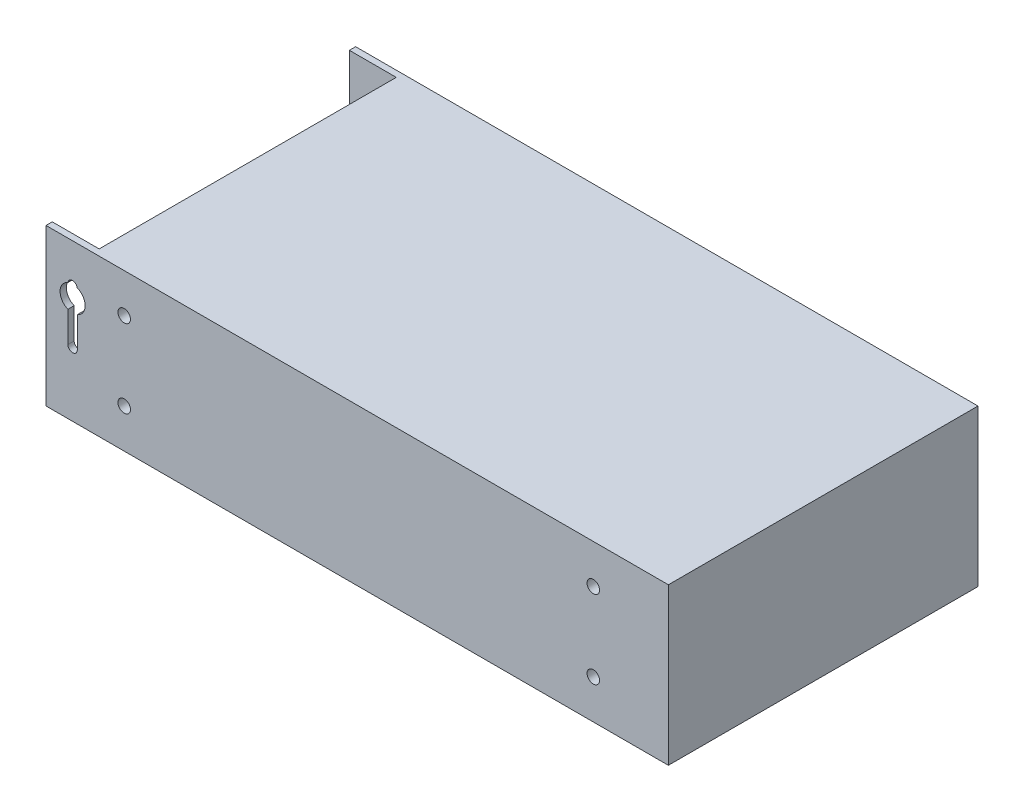
ISO-10303-21;
HEADER;
FILE_DESCRIPTION(('STEP AP214'),'2;1');
FILE_NAME('part.step','',(''),(''),'','','');
FILE_SCHEMA(('AUTOMOTIVE_DESIGN { 1 0 10303 214 1 1 1 1 }'));
ENDSEC;
DATA;
#1=APPLICATION_CONTEXT('core data for automotive mechanical design processes');
#2=APPLICATION_PROTOCOL_DEFINITION('international standard','automotive_design',2000,#1);
#3=PRODUCT_CONTEXT('',#1,'mechanical');
#4=PRODUCT('Part','Part','',(#3));
#5=PRODUCT_RELATED_PRODUCT_CATEGORY('part','',(#4));
#6=PRODUCT_DEFINITION_FORMATION('','',#4);
#7=PRODUCT_DEFINITION_CONTEXT('part definition',#1,'design');
#8=PRODUCT_DEFINITION('design','',#6,#7);
#9=PRODUCT_DEFINITION_SHAPE('','',#8);
#10=(LENGTH_UNIT() NAMED_UNIT(*) SI_UNIT(.MILLI.,.METRE.));
#11=(NAMED_UNIT(*) PLANE_ANGLE_UNIT() SI_UNIT($,.RADIAN.));
#12=(NAMED_UNIT(*) SI_UNIT($,.STERADIAN.) SOLID_ANGLE_UNIT());
#13=UNCERTAINTY_MEASURE_WITH_UNIT(LENGTH_MEASURE(1.E-05),#10,'distance_accuracy_value','');
#14=(GEOMETRIC_REPRESENTATION_CONTEXT(3) GLOBAL_UNCERTAINTY_ASSIGNED_CONTEXT((#13)) GLOBAL_UNIT_ASSIGNED_CONTEXT((#10,
#11,#12)) REPRESENTATION_CONTEXT('',''));
#15=CARTESIAN_POINT('',(0.,0.,0.));
#16=DIRECTION('',(0.,0.,1.));
#17=DIRECTION('',(1.,0.,0.));
#18=AXIS2_PLACEMENT_3D('',#15,#16,#17);
#19=CARTESIAN_POINT('',(0.,9.,0.));
#20=DIRECTION('',(0.,-1.,0.));
#21=DIRECTION('',(0.,0.,-1.));
#22=AXIS2_PLACEMENT_3D('',#19,#20,#21);
#23=PLANE('',#22);
#24=DIRECTION('',(0.,0.,1.));
#25=VECTOR('',#24,1.);
#26=CARTESIAN_POINT('',(-72.7493541907483,9.,-45.9880603807705));
#27=LINE('',#26,#25);
#28=CARTESIAN_POINT('',(-72.7493541907483,9.,-45.9880603807705));
#29=VERTEX_POINT('',#28);
#30=CARTESIAN_POINT('',(-72.7493541907483,9.,49.0119396192294));
#31=VERTEX_POINT('',#30);
#32=EDGE_CURVE('E207',#29,#31,#27,.T.);
#33=ORIENTED_EDGE('',*,*,#32,.F.);
#34=DIRECTION('',(1.,0.,0.));
#35=VECTOR('',#34,1.);
#36=CARTESIAN_POINT('',(-87.7493541907484,9.,-45.9880603807705));
#37=LINE('',#36,#35);
#38=CARTESIAN_POINT('',(-87.7493541907484,9.,-45.9880603807705));
#39=VERTEX_POINT('',#38);
#40=EDGE_CURVE('E218',#39,#29,#37,.T.);
#41=ORIENTED_EDGE('',*,*,#40,.F.);
#42=DIRECTION('',(0.,0.,1.));
#43=VECTOR('',#42,1.);
#44=CARTESIAN_POINT('',(-87.7493541907484,9.,-47.9880603807706));
#45=LINE('',#44,#43);
#46=CARTESIAN_POINT('',(-87.7493541907484,9.,49.0119396192295));
#47=VERTEX_POINT('',#46);
#48=EDGE_CURVE('E249',#39,#47,#45,.T.);
#49=ORIENTED_EDGE('',*,*,#48,.T.);
#50=DIRECTION('',(-1.,0.,0.));
#51=VECTOR('',#50,1.);
#52=CARTESIAN_POINT('',(111.250645809264,9.,49.0119396192294));
#53=LINE('',#52,#51);
#54=EDGE_CURVE('E38',#31,#47,#53,.T.);
#55=ORIENTED_EDGE('',*,*,#54,.F.);
#56=EDGE_LOOP('',(#33,#41,#49,#55));
#57=FACE_BOUND('',#56,.T.);
#58=ADVANCED_FACE('F34',(#57),#23,.F.);
#59=CARTESIAN_POINT('',(111.250645809264,50.,49.0119396192294));
#60=DIRECTION('',(0.,0.,1.));
#61=DIRECTION('',(1.,0.,0.));
#62=AXIS2_PLACEMENT_3D('',#59,#60,#61);
#63=PLANE('',#62);
#64=DIRECTION('',(0.,1.,0.));
#65=VECTOR('',#64,1.);
#66=CARTESIAN_POINT('',(-77.7493541907484,50.,49.0119396192295));
#67=LINE('',#66,#65);
#68=CARTESIAN_POINT('',(-77.7493541907484,20.5,49.0119396192295));
#69=VERTEX_POINT('',#68);
#70=CARTESIAN_POINT('',(-77.7493541907484,30.2919007564522,49.0119396192295));
#71=VERTEX_POINT('',#70);
#72=EDGE_CURVE('E185',#69,#71,#67,.T.);
#73=ORIENTED_EDGE('',*,*,#72,.T.);
#74=CARTESIAN_POINT('',(-79.2493541907484,34.,49.0119396192295));
#75=DIRECTION('',(0.,0.,1.));
#76=DIRECTION('',(1.,0.,0.));
#77=AXIS2_PLACEMENT_3D('',#74,#75,#76);
#78=CIRCLE('',#77,4.00000000000001);
#79=CARTESIAN_POINT('',(-77.7647392128322,37.7142857142857,49.0119396192295));
#80=VERTEX_POINT('',#79);
#81=EDGE_CURVE('E188',#71,#80,#78,.T.);
#82=ORIENTED_EDGE('',*,*,#81,.T.);
#83=CARTESIAN_POINT('',(-79.2493541907484,37.5,49.0119396192295));
#84=DIRECTION('',(0.,0.,1.));
#85=DIRECTION('',(1.,0.,0.));
#86=AXIS2_PLACEMENT_3D('',#83,#84,#85);
#87=CIRCLE('',#86,1.5);
#88=CARTESIAN_POINT('',(-80.7339691686645,37.7142857142857,49.0119396192295));
#89=VERTEX_POINT('',#88);
#90=EDGE_CURVE('E171',#80,#89,#87,.T.);
#91=ORIENTED_EDGE('',*,*,#90,.T.);
#92=CARTESIAN_POINT('',(-79.2493541907484,34.,49.0119396192295));
#93=DIRECTION('',(0.,0.,1.));
#94=DIRECTION('',(1.,0.,0.));
#95=AXIS2_PLACEMENT_3D('',#92,#93,#94);
#96=CIRCLE('',#95,4.00000000000001);
#97=CARTESIAN_POINT('',(-80.7493541907484,30.2919007564522,49.0119396192295));
#98=VERTEX_POINT('',#97);
#99=EDGE_CURVE('E144',#89,#98,#96,.T.);
#100=ORIENTED_EDGE('',*,*,#99,.T.);
#101=DIRECTION('',(0.,1.,0.));
#102=VECTOR('',#101,1.);
#103=CARTESIAN_POINT('',(-80.7493541907484,50.,49.0119396192295));
#104=LINE('',#103,#102);
#105=CARTESIAN_POINT('',(-80.7493541907484,20.5,49.0119396192295));
#106=VERTEX_POINT('',#105);
#107=EDGE_CURVE('E180',#106,#98,#104,.T.);
#108=ORIENTED_EDGE('',*,*,#107,.F.);
#109=CARTESIAN_POINT('',(-79.2493541907484,20.5,49.0119396192295));
#110=DIRECTION('',(0.,0.,1.));
#111=DIRECTION('',(1.,0.,0.));
#112=AXIS2_PLACEMENT_3D('',#109,#110,#111);
#113=CIRCLE('',#112,1.5);
#114=EDGE_CURVE('E182',#106,#69,#113,.T.);
#115=ORIENTED_EDGE('',*,*,#114,.T.);
#116=EDGE_LOOP('',(#73,#82,#91,#100,#108,#115));
#117=FACE_BOUND('',#116,.T.);
#118=DIRECTION('',(0.,-1.,0.));
#119=VECTOR('',#118,1.);
#120=CARTESIAN_POINT('',(-72.7493541907483,50.,49.0119396192294));
#121=LINE('',#120,#119);
#122=CARTESIAN_POINT('',(-72.7493541907483,50.,49.0119396192294));
#123=VERTEX_POINT('',#122);
#124=EDGE_CURVE('E212',#123,#31,#121,.T.);
#125=ORIENTED_EDGE('',*,*,#124,.T.);
#126=ORIENTED_EDGE('',*,*,#54,.T.);
#127=DIRECTION('',(0.,-1.,0.));
#128=VECTOR('',#127,1.);
#129=CARTESIAN_POINT('',(-87.7493541907484,50.,49.0119396192295));
#130=LINE('',#129,#128);
#131=CARTESIAN_POINT('',(-87.7493541907484,50.,49.0119396192295));
#132=VERTEX_POINT('',#131);
#133=EDGE_CURVE('E242',#132,#47,#130,.T.);
#134=ORIENTED_EDGE('',*,*,#133,.F.);
#135=DIRECTION('',(-1.,0.,0.));
#136=VECTOR('',#135,1.);
#137=CARTESIAN_POINT('',(111.250645809264,50.,49.0119396192294));
#138=LINE('',#137,#136);
#139=EDGE_CURVE('E235',#123,#132,#138,.T.);
#140=ORIENTED_EDGE('',*,*,#139,.F.);
#141=EDGE_LOOP('',(#125,#126,#134,#140));
#142=FACE_BOUND('',#141,.T.);
#143=ADVANCED_FACE('F298',(#117,#142),#63,.F.);
#144=CARTESIAN_POINT('',(-87.7493541907484,50.,-45.9880603807705));
#145=DIRECTION('',(0.,0.,-1.));
#146=DIRECTION('',(-1.,0.,0.));
#147=AXIS2_PLACEMENT_3D('',#144,#145,#146);
#148=PLANE('',#147);
#149=DIRECTION('',(0.,-1.,0.));
#150=VECTOR('',#149,1.);
#151=CARTESIAN_POINT('',(-72.7493541907483,50.,-45.9880603807705));
#152=LINE('',#151,#150);
#153=CARTESIAN_POINT('',(-72.7493541907483,50.,-45.9880603807705));
#154=VERTEX_POINT('',#153);
#155=EDGE_CURVE('E216',#154,#29,#152,.T.);
#156=ORIENTED_EDGE('',*,*,#155,.F.);
#157=DIRECTION('',(1.,0.,0.));
#158=VECTOR('',#157,1.);
#159=CARTESIAN_POINT('',(-87.7493541907484,50.,-45.9880603807705));
#160=LINE('',#159,#158);
#161=CARTESIAN_POINT('',(-87.7493541907484,50.,-45.9880603807705));
#162=VERTEX_POINT('',#161);
#163=EDGE_CURVE('E222',#162,#154,#160,.T.);
#164=ORIENTED_EDGE('',*,*,#163,.F.);
#165=DIRECTION('',(0.,-1.,0.));
#166=VECTOR('',#165,1.);
#167=CARTESIAN_POINT('',(-87.7493541907484,50.,-45.9880603807705));
#168=LINE('',#167,#166);
#169=EDGE_CURVE('E228',#162,#39,#168,.T.);
#170=ORIENTED_EDGE('',*,*,#169,.T.);
#171=ORIENTED_EDGE('',*,*,#40,.T.);
#172=EDGE_LOOP('',(#156,#164,#170,#171));
#173=FACE_BOUND('',#172,.T.);
#174=ADVANCED_FACE('F289',(#173),#148,.F.);
#175=CARTESIAN_POINT('',(111.250645809264,9.,-47.9880603807706));
#176=DIRECTION('',(-1.,0.,0.));
#177=DIRECTION('',(0.,0.,1.));
#178=AXIS2_PLACEMENT_3D('',#175,#176,#177);
#179=PLANE('',#178);
#180=DIRECTION('',(0.,0.,-1.));
#181=VECTOR('',#180,1.);
#182=CARTESIAN_POINT('',(111.250645809264,0.,-47.9880603807706));
#183=LINE('',#182,#181);
#184=CARTESIAN_POINT('',(111.250645809264,0.,51.0119396192294));
#185=VERTEX_POINT('',#184);
#186=CARTESIAN_POINT('',(111.250645809264,0.,-47.9880603807706));
#187=VERTEX_POINT('',#186);
#188=EDGE_CURVE('E247',#185,#187,#183,.T.);
#189=ORIENTED_EDGE('',*,*,#188,.T.);
#190=DIRECTION('',(0.,-1.,0.));
#191=VECTOR('',#190,1.);
#192=CARTESIAN_POINT('',(111.250645809264,9.,-47.9880603807706));
#193=LINE('',#192,#191);
#194=CARTESIAN_POINT('',(111.250645809264,50.,-47.9880603807706));
#195=VERTEX_POINT('',#194);
#196=EDGE_CURVE('E11',#195,#187,#193,.T.);
#197=ORIENTED_EDGE('',*,*,#196,.F.);
#198=DIRECTION('',(0.,0.,-1.));
#199=VECTOR('',#198,1.);
#200=CARTESIAN_POINT('',(111.250645809264,50.,51.0119396192294));
#201=LINE('',#200,#199);
#202=CARTESIAN_POINT('',(111.250645809264,50.,51.0119396192294));
#203=VERTEX_POINT('',#202);
#204=EDGE_CURVE('E233',#203,#195,#201,.T.);
#205=ORIENTED_EDGE('',*,*,#204,.F.);
#206=DIRECTION('',(0.,-1.,0.));
#207=VECTOR('',#206,1.);
#208=CARTESIAN_POINT('',(111.250645809264,9.,51.0119396192294));
#209=LINE('',#208,#207);
#210=EDGE_CURVE('E252',#203,#185,#209,.T.);
#211=ORIENTED_EDGE('',*,*,#210,.T.);
#212=EDGE_LOOP('',(#189,#197,#205,#211));
#213=FACE_BOUND('',#212,.T.);
#214=ADVANCED_FACE('F36',(#213),#179,.F.);
#215=CARTESIAN_POINT('',(111.250645809264,9.,-47.9880603807706));
#216=DIRECTION('',(0.,0.,1.));
#217=DIRECTION('',(1.,0.,0.));
#218=AXIS2_PLACEMENT_3D('',#215,#216,#217);
#219=PLANE('',#218);
#220=CARTESIAN_POINT('',(-62.7493541907484,12.5,-47.9880603807706));
#221=DIRECTION('',(0.,0.,-1.));
#222=DIRECTION('',(-1.,0.,0.));
#223=AXIS2_PLACEMENT_3D('',#220,#221,#222);
#224=CIRCLE('',#223,2.);
#225=CARTESIAN_POINT('',(-64.7493541907484,12.5,-47.9880603807706));
#226=VERTEX_POINT('',#225);
#227=EDGE_CURVE('E428',#226,#226,#224,.T.);
#228=ORIENTED_EDGE('',*,*,#227,.F.);
#229=EDGE_LOOP('',(#228));
#230=FACE_BOUND('',#229,.T.);
#231=CARTESIAN_POINT('',(87.2506458092516,12.5,-47.9880603807706));
#232=DIRECTION('',(0.,0.,-1.));
#233=DIRECTION('',(-1.,0.,0.));
#234=AXIS2_PLACEMENT_3D('',#231,#232,#233);
#235=CIRCLE('',#234,2.);
#236=CARTESIAN_POINT('',(85.2506458092516,12.5,-47.9880603807706));
#237=VERTEX_POINT('',#236);
#238=EDGE_CURVE('E433',#237,#237,#235,.T.);
#239=ORIENTED_EDGE('',*,*,#238,.F.);
#240=EDGE_LOOP('',(#239));
#241=FACE_BOUND('',#240,.T.);
#242=DIRECTION('',(-1.,0.,0.));
#243=VECTOR('',#242,1.);
#244=CARTESIAN_POINT('',(111.250645809264,0.,-47.9880603807706));
#245=LINE('',#244,#243);
#246=CARTESIAN_POINT('',(-87.7493541907484,0.,-47.9880603807706));
#247=VERTEX_POINT('',#246);
#248=EDGE_CURVE('E267',#187,#247,#245,.T.);
#249=ORIENTED_EDGE('',*,*,#248,.T.);
#250=DIRECTION('',(0.,-1.,0.));
#251=VECTOR('',#250,1.);
#252=CARTESIAN_POINT('',(-87.7493541907484,9.,-47.9880603807706));
#253=LINE('',#252,#251);
#254=CARTESIAN_POINT('',(-87.7493541907484,50.,-47.9880603807706));
#255=VERTEX_POINT('',#254);
#256=EDGE_CURVE('E44',#255,#247,#253,.T.);
#257=ORIENTED_EDGE('',*,*,#256,.F.);
#258=DIRECTION('',(-1.,0.,0.));
#259=VECTOR('',#258,1.);
#260=CARTESIAN_POINT('',(-87.7493541907484,50.,-47.9880603807706));
#261=LINE('',#260,#259);
#262=EDGE_CURVE('E225',#195,#255,#261,.T.);
#263=ORIENTED_EDGE('',*,*,#262,.F.);
#264=ORIENTED_EDGE('',*,*,#196,.T.);
#265=EDGE_LOOP('',(#249,#257,#263,#264));
#266=FACE_BOUND('',#265,.T.);
#267=ADVANCED_FACE('F279',(#230,#241,#266),#219,.F.);
#268=CARTESIAN_POINT('',(-87.7493541907484,9.,-47.9880603807706));
#269=DIRECTION('',(1.,0.,0.));
#270=DIRECTION('',(0.,0.,-1.));
#271=AXIS2_PLACEMENT_3D('',#268,#269,#270);
#272=PLANE('',#271);
#273=DIRECTION('',(0.,0.,1.));
#274=VECTOR('',#273,1.);
#275=CARTESIAN_POINT('',(-87.7493541907484,0.,-47.9880603807706));
#276=LINE('',#275,#274);
#277=CARTESIAN_POINT('',(-87.7493541907484,0.,51.0119396192295));
#278=VERTEX_POINT('',#277);
#279=EDGE_CURVE('E266',#247,#278,#276,.T.);
#280=ORIENTED_EDGE('',*,*,#279,.T.);
#281=DIRECTION('',(0.,-1.,0.));
#282=VECTOR('',#281,1.);
#283=CARTESIAN_POINT('',(-87.7493541907484,9.,51.0119396192295));
#284=LINE('',#283,#282);
#285=CARTESIAN_POINT('',(-87.7493541907484,50.,51.0119396192294));
#286=VERTEX_POINT('',#285);
#287=EDGE_CURVE('E260',#286,#278,#284,.T.);
#288=ORIENTED_EDGE('',*,*,#287,.F.);
#289=DIRECTION('',(0.,0.,1.));
#290=VECTOR('',#289,1.);
#291=CARTESIAN_POINT('',(-87.7493541907484,50.,51.0119396192294));
#292=LINE('',#291,#290);
#293=EDGE_CURVE('E237',#132,#286,#292,.T.);
#294=ORIENTED_EDGE('',*,*,#293,.F.);
#295=ORIENTED_EDGE('',*,*,#133,.T.);
#296=ORIENTED_EDGE('',*,*,#48,.F.);
#297=ORIENTED_EDGE('',*,*,#169,.F.);
#298=DIRECTION('',(0.,0.,1.));
#299=VECTOR('',#298,1.);
#300=CARTESIAN_POINT('',(-87.7493541907484,50.,-47.9880603807706));
#301=LINE('',#300,#299);
#302=EDGE_CURVE('E219',#255,#162,#301,.T.);
#303=ORIENTED_EDGE('',*,*,#302,.F.);
#304=ORIENTED_EDGE('',*,*,#256,.T.);
#305=EDGE_LOOP('',(#280,#288,#294,#295,#296,#297,#303,#304));
#306=FACE_BOUND('',#305,.T.);
#307=ADVANCED_FACE('F285',(#306),#272,.F.);
#308=CARTESIAN_POINT('',(111.250645809264,9.,51.0119396192294));
#309=DIRECTION('',(0.,0.,-1.));
#310=DIRECTION('',(-1.,0.,0.));
#311=AXIS2_PLACEMENT_3D('',#308,#309,#310);
#312=PLANE('',#311);
#313=CARTESIAN_POINT('',(-79.2493541907484,37.5,51.0119396192294));
#314=DIRECTION('',(0.,0.,1.));
#315=DIRECTION('',(1.,0.,0.));
#316=AXIS2_PLACEMENT_3D('',#313,#314,#315);
#317=CIRCLE('',#316,1.5);
#318=CARTESIAN_POINT('',(-77.7647392128322,37.7142857142857,51.0119396192295));
#319=VERTEX_POINT('',#318);
#320=CARTESIAN_POINT('',(-80.7339691686645,37.7142857142857,51.0119396192294));
#321=VERTEX_POINT('',#320);
#322=EDGE_CURVE('E150',#319,#321,#317,.T.);
#323=ORIENTED_EDGE('',*,*,#322,.F.);
#324=CARTESIAN_POINT('',(-79.2493541907484,34.,51.0119396192294));
#325=DIRECTION('',(0.,0.,1.));
#326=DIRECTION('',(1.,0.,0.));
#327=AXIS2_PLACEMENT_3D('',#324,#325,#326);
#328=CIRCLE('',#327,4.00000000000001);
#329=CARTESIAN_POINT('',(-77.7493541907484,30.2919007564522,51.0119396192294));
#330=VERTEX_POINT('',#329);
#331=EDGE_CURVE('E60',#330,#319,#328,.T.);
#332=ORIENTED_EDGE('',*,*,#331,.F.);
#333=DIRECTION('',(0.,1.,0.));
#334=VECTOR('',#333,1.);
#335=CARTESIAN_POINT('',(-77.7493541907484,0.,51.0119396192294));
#336=LINE('',#335,#334);
#337=CARTESIAN_POINT('',(-77.7493541907484,20.5,51.0119396192294));
#338=VERTEX_POINT('',#337);
#339=EDGE_CURVE('E166',#338,#330,#336,.T.);
#340=ORIENTED_EDGE('',*,*,#339,.F.);
#341=CARTESIAN_POINT('',(-79.2493541907484,20.5,51.0119396192294));
#342=DIRECTION('',(0.,0.,1.));
#343=DIRECTION('',(1.,0.,0.));
#344=AXIS2_PLACEMENT_3D('',#341,#342,#343);
#345=CIRCLE('',#344,1.5);
#346=CARTESIAN_POINT('',(-80.7493541907484,20.5,51.0119396192294));
#347=VERTEX_POINT('',#346);
#348=EDGE_CURVE('E160',#347,#338,#345,.T.);
#349=ORIENTED_EDGE('',*,*,#348,.F.);
#350=DIRECTION('',(0.,1.,0.));
#351=VECTOR('',#350,1.);
#352=CARTESIAN_POINT('',(-80.7493541907484,0.,51.0119396192294));
#353=LINE('',#352,#351);
#354=CARTESIAN_POINT('',(-80.7493541907484,30.2919007564522,51.0119396192294));
#355=VERTEX_POINT('',#354);
#356=EDGE_CURVE('E158',#347,#355,#353,.T.);
#357=ORIENTED_EDGE('',*,*,#356,.T.);
#358=CARTESIAN_POINT('',(-79.2493541907484,34.,51.0119396192294));
#359=DIRECTION('',(0.,0.,1.));
#360=DIRECTION('',(1.,0.,0.));
#361=AXIS2_PLACEMENT_3D('',#358,#359,#360);
#362=CIRCLE('',#361,4.00000000000001);
#363=EDGE_CURVE('E141',#321,#355,#362,.T.);
#364=ORIENTED_EDGE('',*,*,#363,.F.);
#365=EDGE_LOOP('',(#323,#332,#340,#349,#357,#364));
#366=FACE_BOUND('',#365,.T.);
#367=CARTESIAN_POINT('',(87.2506458092417,12.4999999999993,51.0119396192294));
#368=DIRECTION('',(0.,0.,1.));
#369=DIRECTION('',(1.,0.,0.));
#370=AXIS2_PLACEMENT_3D('',#367,#368,#369);
#371=CIRCLE('',#370,2.);
#372=CARTESIAN_POINT('',(89.2506458092417,12.4999999999993,51.0119396192294));
#373=VERTEX_POINT('',#372);
#374=EDGE_CURVE('E191',#373,#373,#371,.T.);
#375=ORIENTED_EDGE('',*,*,#374,.F.);
#376=EDGE_LOOP('',(#375));
#377=FACE_BOUND('',#376,.T.);
#378=CARTESIAN_POINT('',(87.2506458092701,37.4999999999659,51.0119396192294));
#379=DIRECTION('',(0.,0.,1.));
#380=DIRECTION('',(1.,0.,0.));
#381=AXIS2_PLACEMENT_3D('',#378,#379,#380);
#382=CIRCLE('',#381,2.);
#383=CARTESIAN_POINT('',(89.2506458092701,37.4999999999659,51.0119396192294));
#384=VERTEX_POINT('',#383);
#385=EDGE_CURVE('E195',#384,#384,#382,.T.);
#386=ORIENTED_EDGE('',*,*,#385,.F.);
#387=EDGE_LOOP('',(#386));
#388=FACE_BOUND('',#387,.T.);
#389=CARTESIAN_POINT('',(-62.7493541907569,12.5000000000171,51.0119396192294));
#390=DIRECTION('',(0.,0.,1.));
#391=DIRECTION('',(1.,0.,0.));
#392=AXIS2_PLACEMENT_3D('',#389,#390,#391);
#393=CIRCLE('',#392,2.);
#394=CARTESIAN_POINT('',(-60.7493541907569,12.5000000000171,51.0119396192294));
#395=VERTEX_POINT('',#394);
#396=EDGE_CURVE('E198',#395,#395,#393,.T.);
#397=ORIENTED_EDGE('',*,*,#396,.F.);
#398=EDGE_LOOP('',(#397));
#399=FACE_BOUND('',#398,.T.);
#400=CARTESIAN_POINT('',(-62.7493541907427,37.5000000000227,51.0119396192294));
#401=DIRECTION('',(0.,0.,1.));
#402=DIRECTION('',(1.,0.,0.));
#403=AXIS2_PLACEMENT_3D('',#400,#401,#402);
#404=CIRCLE('',#403,2.);
#405=CARTESIAN_POINT('',(-60.7493541907427,37.5000000000227,51.0119396192294));
#406=VERTEX_POINT('',#405);
#407=EDGE_CURVE('E203',#406,#406,#404,.T.);
#408=ORIENTED_EDGE('',*,*,#407,.F.);
#409=EDGE_LOOP('',(#408));
#410=FACE_BOUND('',#409,.T.);
#411=DIRECTION('',(1.,0.,0.));
#412=VECTOR('',#411,1.);
#413=CARTESIAN_POINT('',(111.250645809264,0.,51.0119396192294));
#414=LINE('',#413,#412);
#415=EDGE_CURVE('E253',#278,#185,#414,.T.);
#416=ORIENTED_EDGE('',*,*,#415,.T.);
#417=ORIENTED_EDGE('',*,*,#210,.F.);
#418=DIRECTION('',(1.,0.,0.));
#419=VECTOR('',#418,1.);
#420=CARTESIAN_POINT('',(111.250645809264,50.,51.0119396192294));
#421=LINE('',#420,#419);
#422=EDGE_CURVE('E240',#286,#203,#421,.T.);
#423=ORIENTED_EDGE('',*,*,#422,.F.);
#424=ORIENTED_EDGE('',*,*,#287,.T.);
#425=EDGE_LOOP('',(#416,#417,#423,#424));
#426=FACE_BOUND('',#425,.T.);
#427=ADVANCED_FACE('F154',(#366,#377,#388,#399,#410,#426),#312,.F.);
#428=CARTESIAN_POINT('',(0.,0.,0.));
#429=DIRECTION('',(0.,-1.,0.));
#430=DIRECTION('',(0.,0.,-1.));
#431=AXIS2_PLACEMENT_3D('',#428,#429,#430);
#432=PLANE('',#431);
#433=CARTESIAN_POINT('',(77.2506458092516,0.,26.5119396192294));
#434=DIRECTION('',(0.,-1.,0.));
#435=DIRECTION('',(0.,0.,-1.));
#436=AXIS2_PLACEMENT_3D('',#433,#434,#435);
#437=CIRCLE('',#436,1.5);
#438=CARTESIAN_POINT('',(77.2506458092516,0.,25.0119396192294));
#439=VERTEX_POINT('',#438);
#440=EDGE_CURVE('E408',#439,#439,#437,.T.);
#441=ORIENTED_EDGE('',*,*,#440,.F.);
#442=EDGE_LOOP('',(#441));
#443=FACE_BOUND('',#442,.T.);
#444=CARTESIAN_POINT('',(77.2506458092516,0.,-23.4880603807706));
#445=DIRECTION('',(0.,-1.,0.));
#446=DIRECTION('',(0.,0.,-1.));
#447=AXIS2_PLACEMENT_3D('',#444,#445,#446);
#448=CIRCLE('',#447,1.5);
#449=CARTESIAN_POINT('',(77.2506458092516,0.,-24.9880603807706));
#450=VERTEX_POINT('',#449);
#451=EDGE_CURVE('E412',#450,#450,#448,.T.);
#452=ORIENTED_EDGE('',*,*,#451,.F.);
#453=EDGE_LOOP('',(#452));
#454=FACE_BOUND('',#453,.T.);
#455=CARTESIAN_POINT('',(-72.7493541907484,0.,-23.4880603807706));
#456=DIRECTION('',(0.,-1.,0.));
#457=DIRECTION('',(0.,0.,-1.));
#458=AXIS2_PLACEMENT_3D('',#455,#456,#457);
#459=CIRCLE('',#458,1.5);
#460=CARTESIAN_POINT('',(-72.7493541907484,0.,-24.9880603807706));
#461=VERTEX_POINT('',#460);
#462=EDGE_CURVE('E419',#461,#461,#459,.T.);
#463=ORIENTED_EDGE('',*,*,#462,.F.);
#464=EDGE_LOOP('',(#463));
#465=FACE_BOUND('',#464,.T.);
#466=CARTESIAN_POINT('',(-72.7493541907484,0.,26.5119396192294));
#467=DIRECTION('',(0.,-1.,0.));
#468=DIRECTION('',(0.,0.,-1.));
#469=AXIS2_PLACEMENT_3D('',#466,#467,#468);
#470=CIRCLE('',#469,1.5);
#471=CARTESIAN_POINT('',(-72.7493541907484,0.,25.0119396192294));
#472=VERTEX_POINT('',#471);
#473=EDGE_CURVE('E422',#472,#472,#470,.T.);
#474=ORIENTED_EDGE('',*,*,#473,.F.);
#475=EDGE_LOOP('',(#474));
#476=FACE_BOUND('',#475,.T.);
#477=ORIENTED_EDGE('',*,*,#188,.F.);
#478=ORIENTED_EDGE('',*,*,#415,.F.);
#479=ORIENTED_EDGE('',*,*,#279,.F.);
#480=ORIENTED_EDGE('',*,*,#248,.F.);
#481=EDGE_LOOP('',(#477,#478,#479,#480));
#482=FACE_BOUND('',#481,.T.);
#483=ADVANCED_FACE('F277',(#443,#454,#465,#476,#482),#432,.T.);
#484=CARTESIAN_POINT('',(0.,50.,0.));
#485=DIRECTION('',(0.,1.,0.));
#486=DIRECTION('',(0.,0.,1.));
#487=AXIS2_PLACEMENT_3D('',#484,#485,#486);
#488=PLANE('',#487);
#489=ORIENTED_EDGE('',*,*,#204,.T.);
#490=ORIENTED_EDGE('',*,*,#262,.T.);
#491=ORIENTED_EDGE('',*,*,#302,.T.);
#492=ORIENTED_EDGE('',*,*,#163,.T.);
#493=DIRECTION('',(0.,0.,1.));
#494=VECTOR('',#493,1.);
#495=CARTESIAN_POINT('',(-72.7493541907483,50.,-45.9880603807705));
#496=LINE('',#495,#494);
#497=EDGE_CURVE('E210',#154,#123,#496,.T.);
#498=ORIENTED_EDGE('',*,*,#497,.T.);
#499=ORIENTED_EDGE('',*,*,#139,.T.);
#500=ORIENTED_EDGE('',*,*,#293,.T.);
#501=ORIENTED_EDGE('',*,*,#422,.T.);
#502=EDGE_LOOP('',(#489,#490,#491,#492,#498,#499,#500,#501));
#503=FACE_BOUND('',#502,.T.);
#504=ADVANCED_FACE('F282',(#503),#488,.T.);
#505=CARTESIAN_POINT('',(-72.7493541907483,50.,-45.9880603807705));
#506=DIRECTION('',(1.,0.,0.));
#507=DIRECTION('',(0.,0.,-1.));
#508=AXIS2_PLACEMENT_3D('',#505,#506,#507);
#509=PLANE('',#508);
#510=ORIENTED_EDGE('',*,*,#32,.T.);
#511=ORIENTED_EDGE('',*,*,#124,.F.);
#512=ORIENTED_EDGE('',*,*,#497,.F.);
#513=ORIENTED_EDGE('',*,*,#155,.T.);
#514=EDGE_LOOP('',(#510,#511,#512,#513));
#515=FACE_BOUND('',#514,.T.);
#516=ADVANCED_FACE('F294',(#515),#509,.F.);
#517=CARTESIAN_POINT('',(-62.7493541907427,37.5000000000227,41.0119396192294));
#518=DIRECTION('',(0.,0.,1.));
#519=DIRECTION('',(1.,0.,0.));
#520=AXIS2_PLACEMENT_3D('',#517,#518,#519);
#521=CYLINDRICAL_SURFACE('',#520,2.);
#522=CARTESIAN_POINT('',(-62.7493541907427,37.5000000000227,41.0119396192294));
#523=DIRECTION('',(0.,0.,1.));
#524=DIRECTION('',(1.,0.,0.));
#525=AXIS2_PLACEMENT_3D('',#522,#523,#524);
#526=CIRCLE('',#525,2.);
#527=CARTESIAN_POINT('',(-60.7493541907427,37.5000000000227,41.0119396192294));
#528=VERTEX_POINT('',#527);
#529=EDGE_CURVE('E204',#528,#528,#526,.T.);
#530=ORIENTED_EDGE('',*,*,#529,.F.);
#531=EDGE_LOOP('',(#530));
#532=FACE_BOUND('',#531,.T.);
#533=ORIENTED_EDGE('',*,*,#407,.T.);
#534=EDGE_LOOP('',(#533));
#535=FACE_BOUND('',#534,.T.);
#536=ADVANCED_FACE('F326',(#532,#535),#521,.F.);
#537=CARTESIAN_POINT('',(-62.7493541907427,37.5000000000227,41.0119396192294));
#538=DIRECTION('',(0.,0.,1.));
#539=DIRECTION('',(1.,0.,0.));
#540=AXIS2_PLACEMENT_3D('',#537,#538,#539);
#541=PLANE('',#540);
#542=ORIENTED_EDGE('',*,*,#529,.T.);
#543=EDGE_LOOP('',(#542));
#544=FACE_BOUND('',#543,.T.);
#545=ADVANCED_FACE('F329',(#544),#541,.T.);
#546=CARTESIAN_POINT('',(-62.7493541907569,12.5000000000171,41.0119396192294));
#547=DIRECTION('',(0.,0.,1.));
#548=DIRECTION('',(1.,0.,0.));
#549=AXIS2_PLACEMENT_3D('',#546,#547,#548);
#550=CYLINDRICAL_SURFACE('',#549,2.);
#551=ORIENTED_EDGE('',*,*,#396,.T.);
#552=EDGE_LOOP('',(#551));
#553=FACE_BOUND('',#552,.T.);
#554=ORIENTED_EDGE('',*,*,#227,.T.);
#555=EDGE_LOOP('',(#554));
#556=FACE_BOUND('',#555,.T.);
#557=ADVANCED_FACE('F333',(#553,#556),#550,.F.);
#558=CARTESIAN_POINT('',(87.2506458092701,37.4999999999659,41.0119396192294));
#559=DIRECTION('',(0.,0.,1.));
#560=DIRECTION('',(1.,0.,0.));
#561=AXIS2_PLACEMENT_3D('',#558,#559,#560);
#562=CYLINDRICAL_SURFACE('',#561,2.);
#563=CARTESIAN_POINT('',(87.2506458092701,37.4999999999659,41.0119396192294));
#564=DIRECTION('',(0.,0.,1.));
#565=DIRECTION('',(1.,0.,0.));
#566=AXIS2_PLACEMENT_3D('',#563,#564,#565);
#567=CIRCLE('',#566,2.);
#568=CARTESIAN_POINT('',(89.2506458092701,37.4999999999659,41.0119396192294));
#569=VERTEX_POINT('',#568);
#570=EDGE_CURVE('E194',#569,#569,#567,.T.);
#571=ORIENTED_EDGE('',*,*,#570,.F.);
#572=EDGE_LOOP('',(#571));
#573=FACE_BOUND('',#572,.T.);
#574=ORIENTED_EDGE('',*,*,#385,.T.);
#575=EDGE_LOOP('',(#574));
#576=FACE_BOUND('',#575,.T.);
#577=ADVANCED_FACE('F337',(#573,#576),#562,.F.);
#578=CARTESIAN_POINT('',(87.2506458092701,37.4999999999659,41.0119396192294));
#579=DIRECTION('',(0.,0.,1.));
#580=DIRECTION('',(1.,0.,0.));
#581=AXIS2_PLACEMENT_3D('',#578,#579,#580);
#582=PLANE('',#581);
#583=ORIENTED_EDGE('',*,*,#570,.T.);
#584=EDGE_LOOP('',(#583));
#585=FACE_BOUND('',#584,.T.);
#586=ADVANCED_FACE('F339',(#585),#582,.T.);
#587=CARTESIAN_POINT('',(87.2506458092417,12.4999999999993,41.0119396192294));
#588=DIRECTION('',(0.,0.,1.));
#589=DIRECTION('',(1.,0.,0.));
#590=AXIS2_PLACEMENT_3D('',#587,#588,#589);
#591=CYLINDRICAL_SURFACE('',#590,2.);
#592=ORIENTED_EDGE('',*,*,#374,.T.);
#593=EDGE_LOOP('',(#592));
#594=FACE_BOUND('',#593,.T.);
#595=ORIENTED_EDGE('',*,*,#238,.T.);
#596=EDGE_LOOP('',(#595));
#597=FACE_BOUND('',#596,.T.);
#598=ADVANCED_FACE('F342',(#594,#597),#591,.F.);
#599=CARTESIAN_POINT('',(-79.2493541907484,34.,41.0119396192294));
#600=DIRECTION('',(0.,0.,1.));
#601=DIRECTION('',(1.,0.,0.));
#602=AXIS2_PLACEMENT_3D('',#599,#600,#601);
#603=CYLINDRICAL_SURFACE('',#602,4.00000000000001);
#604=DIRECTION('',(0.,0.,1.));
#605=VECTOR('',#604,1.);
#606=CARTESIAN_POINT('',(-77.7493541907484,30.2919007564522,41.0119396192294));
#607=LINE('',#606,#605);
#608=EDGE_CURVE('E169',#71,#330,#607,.T.);
#609=ORIENTED_EDGE('',*,*,#608,.T.);
#610=ORIENTED_EDGE('',*,*,#331,.T.);
#611=DIRECTION('',(0.,0.,1.));
#612=VECTOR('',#611,1.);
#613=CARTESIAN_POINT('',(-77.7647392128322,37.7142857142857,41.0119396192294));
#614=LINE('',#613,#612);
#615=EDGE_CURVE('E147',#80,#319,#614,.T.);
#616=ORIENTED_EDGE('',*,*,#615,.F.);
#617=ORIENTED_EDGE('',*,*,#81,.F.);
#618=EDGE_LOOP('',(#609,#610,#616,#617));
#619=FACE_BOUND('',#618,.T.);
#620=ADVANCED_FACE('F349',(#619),#603,.F.);
#621=CARTESIAN_POINT('',(-77.7493541907484,0.,41.0119396192294));
#622=DIRECTION('',(1.,0.,0.));
#623=DIRECTION('',(0.,0.,-1.));
#624=AXIS2_PLACEMENT_3D('',#621,#622,#623);
#625=PLANE('',#624);
#626=DIRECTION('',(0.,0.,1.));
#627=VECTOR('',#626,1.);
#628=CARTESIAN_POINT('',(-77.7493541907484,20.5,41.0119396192294));
#629=LINE('',#628,#627);
#630=EDGE_CURVE('E172',#69,#338,#629,.T.);
#631=ORIENTED_EDGE('',*,*,#630,.T.);
#632=ORIENTED_EDGE('',*,*,#339,.T.);
#633=ORIENTED_EDGE('',*,*,#608,.F.);
#634=ORIENTED_EDGE('',*,*,#72,.F.);
#635=EDGE_LOOP('',(#631,#632,#633,#634));
#636=FACE_BOUND('',#635,.T.);
#637=ADVANCED_FACE('F353',(#636),#625,.F.);
#638=CARTESIAN_POINT('',(-79.2493541907484,20.5,41.0119396192294));
#639=DIRECTION('',(0.,0.,1.));
#640=DIRECTION('',(1.,0.,0.));
#641=AXIS2_PLACEMENT_3D('',#638,#639,#640);
#642=CYLINDRICAL_SURFACE('',#641,1.5);
#643=DIRECTION('',(0.,0.,1.));
#644=VECTOR('',#643,1.);
#645=CARTESIAN_POINT('',(-80.7493541907484,20.5,41.0119396192294));
#646=LINE('',#645,#644);
#647=EDGE_CURVE('E174',#106,#347,#646,.T.);
#648=ORIENTED_EDGE('',*,*,#647,.T.);
#649=ORIENTED_EDGE('',*,*,#348,.T.);
#650=ORIENTED_EDGE('',*,*,#630,.F.);
#651=ORIENTED_EDGE('',*,*,#114,.F.);
#652=EDGE_LOOP('',(#648,#649,#650,#651));
#653=FACE_BOUND('',#652,.T.);
#654=ADVANCED_FACE('F362',(#653),#642,.F.);
#655=CARTESIAN_POINT('',(-80.7493541907484,0.,41.0119396192294));
#656=DIRECTION('',(1.,0.,0.));
#657=DIRECTION('',(0.,0.,-1.));
#658=AXIS2_PLACEMENT_3D('',#655,#656,#657);
#659=PLANE('',#658);
#660=ORIENTED_EDGE('',*,*,#107,.T.);
#661=DIRECTION('',(0.,0.,1.));
#662=VECTOR('',#661,1.);
#663=CARTESIAN_POINT('',(-80.7493541907484,30.2919007564522,41.0119396192294));
#664=LINE('',#663,#662);
#665=EDGE_CURVE('E146',#98,#355,#664,.T.);
#666=ORIENTED_EDGE('',*,*,#665,.T.);
#667=ORIENTED_EDGE('',*,*,#356,.F.);
#668=ORIENTED_EDGE('',*,*,#647,.F.);
#669=EDGE_LOOP('',(#660,#666,#667,#668));
#670=FACE_BOUND('',#669,.T.);
#671=ADVANCED_FACE('F359',(#670),#659,.T.);
#672=CARTESIAN_POINT('',(-79.2493541907484,34.,41.0119396192294));
#673=DIRECTION('',(0.,0.,1.));
#674=DIRECTION('',(1.,0.,0.));
#675=AXIS2_PLACEMENT_3D('',#672,#673,#674);
#676=CYLINDRICAL_SURFACE('',#675,4.00000000000001);
#677=DIRECTION('',(0.,0.,1.));
#678=VECTOR('',#677,1.);
#679=CARTESIAN_POINT('',(-80.7339691686645,37.7142857142857,41.0119396192294));
#680=LINE('',#679,#678);
#681=EDGE_CURVE('E52',#89,#321,#680,.T.);
#682=ORIENTED_EDGE('',*,*,#681,.T.);
#683=ORIENTED_EDGE('',*,*,#363,.T.);
#684=ORIENTED_EDGE('',*,*,#665,.F.);
#685=ORIENTED_EDGE('',*,*,#99,.F.);
#686=EDGE_LOOP('',(#682,#683,#684,#685));
#687=FACE_BOUND('',#686,.T.);
#688=ADVANCED_FACE('F138',(#687),#676,.F.);
#689=CARTESIAN_POINT('',(-79.2493541907484,37.5,41.0119396192294));
#690=DIRECTION('',(0.,0.,1.));
#691=DIRECTION('',(1.,0.,0.));
#692=AXIS2_PLACEMENT_3D('',#689,#690,#691);
#693=CYLINDRICAL_SURFACE('',#692,1.5);
#694=ORIENTED_EDGE('',*,*,#615,.T.);
#695=ORIENTED_EDGE('',*,*,#322,.T.);
#696=ORIENTED_EDGE('',*,*,#681,.F.);
#697=ORIENTED_EDGE('',*,*,#90,.F.);
#698=EDGE_LOOP('',(#694,#695,#696,#697));
#699=FACE_BOUND('',#698,.T.);
#700=ADVANCED_FACE('F151',(#699),#693,.F.);
#701=CARTESIAN_POINT('',(-72.7493541907484,6.,26.5119396192294));
#702=DIRECTION('',(0.,-1.,0.));
#703=DIRECTION('',(0.,0.,-1.));
#704=AXIS2_PLACEMENT_3D('',#701,#702,#703);
#705=CYLINDRICAL_SURFACE('',#704,1.5);
#706=CARTESIAN_POINT('',(-72.7493541907484,6.,26.5119396192294));
#707=DIRECTION('',(0.,-1.,0.));
#708=DIRECTION('',(0.,0.,-1.));
#709=AXIS2_PLACEMENT_3D('',#706,#707,#708);
#710=CIRCLE('',#709,1.5);
#711=CARTESIAN_POINT('',(-72.7493541907484,6.,25.0119396192294));
#712=VERTEX_POINT('',#711);
#713=EDGE_CURVE('E425',#712,#712,#710,.T.);
#714=ORIENTED_EDGE('',*,*,#713,.F.);
#715=EDGE_LOOP('',(#714));
#716=FACE_BOUND('',#715,.T.);
#717=ORIENTED_EDGE('',*,*,#473,.T.);
#718=EDGE_LOOP('',(#717));
#719=FACE_BOUND('',#718,.T.);
#720=ADVANCED_FACE('F356',(#716,#719),#705,.F.);
#721=CARTESIAN_POINT('',(-72.7493541907484,6.,26.5119396192294));
#722=DIRECTION('',(0.,-1.,0.));
#723=DIRECTION('',(0.,0.,-1.));
#724=AXIS2_PLACEMENT_3D('',#721,#722,#723);
#725=PLANE('',#724);
#726=ORIENTED_EDGE('',*,*,#713,.T.);
#727=EDGE_LOOP('',(#726));
#728=FACE_BOUND('',#727,.T.);
#729=ADVANCED_FACE('F372',(#728),#725,.T.);
#730=CARTESIAN_POINT('',(-72.7493541907484,6.,-23.4880603807706));
#731=DIRECTION('',(0.,-1.,0.));
#732=DIRECTION('',(0.,0.,-1.));
#733=AXIS2_PLACEMENT_3D('',#730,#731,#732);
#734=CYLINDRICAL_SURFACE('',#733,1.5);
#735=CARTESIAN_POINT('',(-72.7493541907484,6.,-23.4880603807706));
#736=DIRECTION('',(0.,-1.,0.));
#737=DIRECTION('',(0.,0.,-1.));
#738=AXIS2_PLACEMENT_3D('',#735,#736,#737);
#739=CIRCLE('',#738,1.5);
#740=CARTESIAN_POINT('',(-72.7493541907484,6.,-24.9880603807706));
#741=VERTEX_POINT('',#740);
#742=EDGE_CURVE('E417',#741,#741,#739,.T.);
#743=ORIENTED_EDGE('',*,*,#742,.F.);
#744=EDGE_LOOP('',(#743));
#745=FACE_BOUND('',#744,.T.);
#746=ORIENTED_EDGE('',*,*,#462,.T.);
#747=EDGE_LOOP('',(#746));
#748=FACE_BOUND('',#747,.T.);
#749=ADVANCED_FACE('F376',(#745,#748),#734,.F.);
#750=CARTESIAN_POINT('',(-72.7493541907484,6.,-23.4880603807706));
#751=DIRECTION('',(0.,-1.,0.));
#752=DIRECTION('',(0.,0.,-1.));
#753=AXIS2_PLACEMENT_3D('',#750,#751,#752);
#754=PLANE('',#753);
#755=ORIENTED_EDGE('',*,*,#742,.T.);
#756=EDGE_LOOP('',(#755));
#757=FACE_BOUND('',#756,.T.);
#758=ADVANCED_FACE('F378',(#757),#754,.T.);
#759=CARTESIAN_POINT('',(77.2506458092516,6.,-23.4880603807706));
#760=DIRECTION('',(0.,-1.,0.));
#761=DIRECTION('',(0.,0.,-1.));
#762=AXIS2_PLACEMENT_3D('',#759,#760,#761);
#763=CYLINDRICAL_SURFACE('',#762,1.5);
#764=CARTESIAN_POINT('',(77.2506458092516,6.,-23.4880603807706));
#765=DIRECTION('',(0.,-1.,0.));
#766=DIRECTION('',(0.,0.,-1.));
#767=AXIS2_PLACEMENT_3D('',#764,#765,#766);
#768=CIRCLE('',#767,1.5);
#769=CARTESIAN_POINT('',(77.2506458092516,6.,-24.9880603807706));
#770=VERTEX_POINT('',#769);
#771=EDGE_CURVE('E409',#770,#770,#768,.T.);
#772=ORIENTED_EDGE('',*,*,#771,.F.);
#773=EDGE_LOOP('',(#772));
#774=FACE_BOUND('',#773,.T.);
#775=ORIENTED_EDGE('',*,*,#451,.T.);
#776=EDGE_LOOP('',(#775));
#777=FACE_BOUND('',#776,.T.);
#778=ADVANCED_FACE('F381',(#774,#777),#763,.F.);
#779=CARTESIAN_POINT('',(77.2506458092516,6.,-23.4880603807706));
#780=DIRECTION('',(0.,-1.,0.));
#781=DIRECTION('',(0.,0.,-1.));
#782=AXIS2_PLACEMENT_3D('',#779,#780,#781);
#783=PLANE('',#782);
#784=ORIENTED_EDGE('',*,*,#771,.T.);
#785=EDGE_LOOP('',(#784));
#786=FACE_BOUND('',#785,.T.);
#787=ADVANCED_FACE('F386',(#786),#783,.T.);
#788=CARTESIAN_POINT('',(77.2506458092516,6.,26.5119396192294));
#789=DIRECTION('',(0.,-1.,0.));
#790=DIRECTION('',(0.,0.,-1.));
#791=AXIS2_PLACEMENT_3D('',#788,#789,#790);
#792=CYLINDRICAL_SURFACE('',#791,1.5);
#793=CARTESIAN_POINT('',(77.2506458092516,6.,26.5119396192294));
#794=DIRECTION('',(0.,-1.,0.));
#795=DIRECTION('',(0.,0.,-1.));
#796=AXIS2_PLACEMENT_3D('',#793,#794,#795);
#797=CIRCLE('',#796,1.5);
#798=CARTESIAN_POINT('',(77.2506458092516,6.,25.0119396192294));
#799=VERTEX_POINT('',#798);
#800=EDGE_CURVE('E405',#799,#799,#797,.T.);
#801=ORIENTED_EDGE('',*,*,#800,.F.);
#802=EDGE_LOOP('',(#801));
#803=FACE_BOUND('',#802,.T.);
#804=ORIENTED_EDGE('',*,*,#440,.T.);
#805=EDGE_LOOP('',(#804));
#806=FACE_BOUND('',#805,.T.);
#807=ADVANCED_FACE('F389',(#803,#806),#792,.F.);
#808=CARTESIAN_POINT('',(77.2506458092516,6.,26.5119396192294));
#809=DIRECTION('',(0.,-1.,0.));
#810=DIRECTION('',(0.,0.,-1.));
#811=AXIS2_PLACEMENT_3D('',#808,#809,#810);
#812=PLANE('',#811);
#813=ORIENTED_EDGE('',*,*,#800,.T.);
#814=EDGE_LOOP('',(#813));
#815=FACE_BOUND('',#814,.T.);
#816=ADVANCED_FACE('F394',(#815),#812,.T.);
#817=CLOSED_SHELL('',(#58,#143,#174,#214,#267,#307,#427,#483,#504,#516,#536,#545,#557,#577,#586,
#598,#620,#637,#654,#671,#688,#700,#720,#729,#749,#758,#778,#787,#807,#816));
#818=MANIFOLD_SOLID_BREP('B2',#817);
#819=ADVANCED_BREP_SHAPE_REPRESENTATION('',(#18,#818),#14);
#820=SHAPE_DEFINITION_REPRESENTATION(#9,#819);
ENDSEC;
END-ISO-10303-21;
